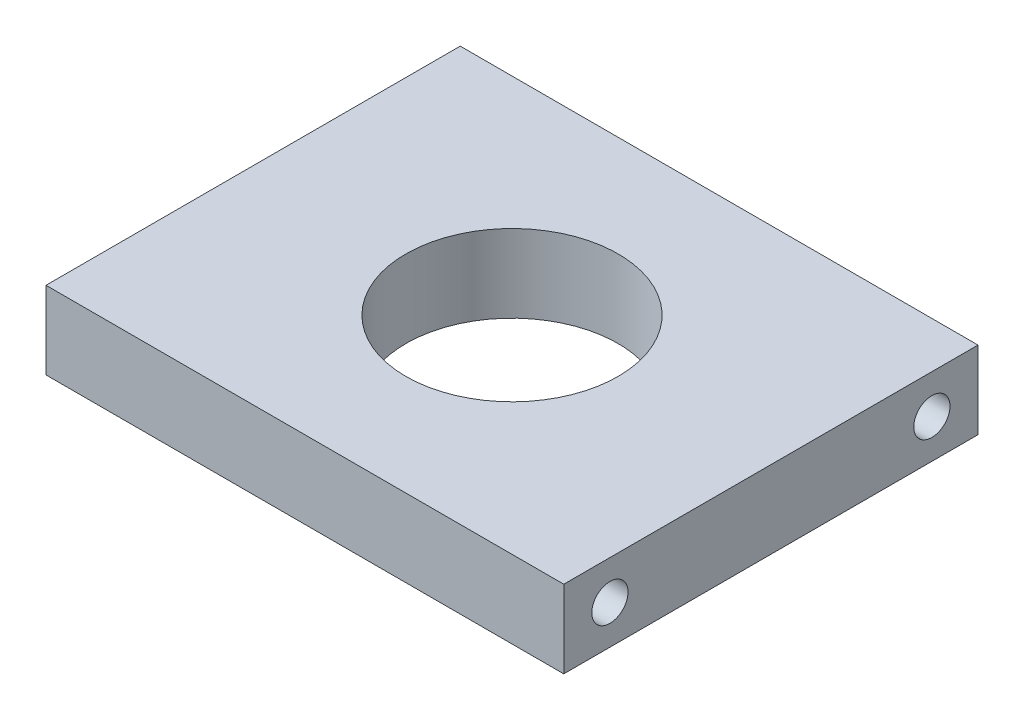
ISO-10303-21;
HEADER;
FILE_DESCRIPTION(('STEP AP214'),'2;1');
FILE_NAME('part.step','',(''),(''),'','','');
FILE_SCHEMA(('AUTOMOTIVE_DESIGN { 1 0 10303 214 1 1 1 1 }'));
ENDSEC;
DATA;
#1=APPLICATION_CONTEXT('core data for automotive mechanical design processes');
#2=APPLICATION_PROTOCOL_DEFINITION('international standard','automotive_design',2000,#1);
#3=PRODUCT_CONTEXT('',#1,'mechanical');
#4=PRODUCT('Part','Part','',(#3));
#5=PRODUCT_RELATED_PRODUCT_CATEGORY('part','',(#4));
#6=PRODUCT_DEFINITION_FORMATION('','',#4);
#7=PRODUCT_DEFINITION_CONTEXT('part definition',#1,'design');
#8=PRODUCT_DEFINITION('design','',#6,#7);
#9=PRODUCT_DEFINITION_SHAPE('','',#8);
#10=(LENGTH_UNIT() NAMED_UNIT(*) SI_UNIT(.MILLI.,.METRE.));
#11=(NAMED_UNIT(*) PLANE_ANGLE_UNIT() SI_UNIT($,.RADIAN.));
#12=(NAMED_UNIT(*) SI_UNIT($,.STERADIAN.) SOLID_ANGLE_UNIT());
#13=UNCERTAINTY_MEASURE_WITH_UNIT(LENGTH_MEASURE(1.E-05),#10,'distance_accuracy_value','');
#14=(GEOMETRIC_REPRESENTATION_CONTEXT(3) GLOBAL_UNCERTAINTY_ASSIGNED_CONTEXT((#13)) GLOBAL_UNIT_ASSIGNED_CONTEXT((#10,
#11,#12)) REPRESENTATION_CONTEXT('',''));
#15=CARTESIAN_POINT('',(0.,0.,0.));
#16=DIRECTION('',(0.,0.,1.));
#17=DIRECTION('',(1.,0.,0.));
#18=AXIS2_PLACEMENT_3D('',#15,#16,#17);
#19=CARTESIAN_POINT('',(0.,15.,0.));
#20=DIRECTION('',(0.,-1.,0.));
#21=DIRECTION('',(0.,0.,-1.));
#22=AXIS2_PLACEMENT_3D('',#19,#20,#21);
#23=PLANE('',#22);
#24=DIRECTION('',(0.,0.,-1.));
#25=VECTOR('',#24,1.);
#26=CARTESIAN_POINT('',(50.,15.,40.));
#27=LINE('',#26,#25);
#28=CARTESIAN_POINT('',(50.,15.,40.));
#29=VERTEX_POINT('',#28);
#30=CARTESIAN_POINT('',(50.,15.,-40.));
#31=VERTEX_POINT('',#30);
#32=EDGE_CURVE('E96',#29,#31,#27,.T.);
#33=ORIENTED_EDGE('',*,*,#32,.T.);
#34=DIRECTION('',(-1.,0.,0.));
#35=VECTOR('',#34,1.);
#36=CARTESIAN_POINT('',(-50.,15.,-40.));
#37=LINE('',#36,#35);
#38=CARTESIAN_POINT('',(-50.,15.,-40.));
#39=VERTEX_POINT('',#38);
#40=EDGE_CURVE('E91',#31,#39,#37,.T.);
#41=ORIENTED_EDGE('',*,*,#40,.T.);
#42=DIRECTION('',(0.,0.,1.));
#43=VECTOR('',#42,1.);
#44=CARTESIAN_POINT('',(-50.,15.,40.));
#45=LINE('',#44,#43);
#46=CARTESIAN_POINT('',(-50.,15.,40.));
#47=VERTEX_POINT('',#46);
#48=EDGE_CURVE('E94',#39,#47,#45,.T.);
#49=ORIENTED_EDGE('',*,*,#48,.T.);
#50=DIRECTION('',(1.,0.,0.));
#51=VECTOR('',#50,1.);
#52=CARTESIAN_POINT('',(-50.,15.,40.));
#53=LINE('',#52,#51);
#54=EDGE_CURVE('E61',#47,#29,#53,.T.);
#55=ORIENTED_EDGE('',*,*,#54,.T.);
#56=EDGE_LOOP('',(#33,#41,#49,#55));
#57=FACE_BOUND('',#56,.T.);
#58=CARTESIAN_POINT('',(0.,15.,0.));
#59=DIRECTION('',(0.,1.,0.));
#60=DIRECTION('',(0.,0.,1.));
#61=AXIS2_PLACEMENT_3D('',#58,#59,#60);
#62=CIRCLE('',#61,20.5);
#63=CARTESIAN_POINT('',(0.,15.,20.5));
#64=VERTEX_POINT('',#63);
#65=EDGE_CURVE('E116',#64,#64,#62,.T.);
#66=ORIENTED_EDGE('',*,*,#65,.F.);
#67=EDGE_LOOP('',(#66));
#68=FACE_BOUND('',#67,.T.);
#69=ADVANCED_FACE('F43',(#57,#68),#23,.F.);
#70=CARTESIAN_POINT('',(0.,0.,0.));
#71=DIRECTION('',(0.,-1.,0.));
#72=DIRECTION('',(0.,0.,-1.));
#73=AXIS2_PLACEMENT_3D('',#70,#71,#72);
#74=PLANE('',#73);
#75=DIRECTION('',(0.,0.,-1.));
#76=VECTOR('',#75,1.);
#77=CARTESIAN_POINT('',(50.,0.,40.));
#78=LINE('',#77,#76);
#79=CARTESIAN_POINT('',(50.,0.,40.));
#80=VERTEX_POINT('',#79);
#81=CARTESIAN_POINT('',(50.,0.,-40.));
#82=VERTEX_POINT('',#81);
#83=EDGE_CURVE('E112',#80,#82,#78,.T.);
#84=ORIENTED_EDGE('',*,*,#83,.F.);
#85=DIRECTION('',(1.,0.,0.));
#86=VECTOR('',#85,1.);
#87=CARTESIAN_POINT('',(-50.,0.,40.));
#88=LINE('',#87,#86);
#89=CARTESIAN_POINT('',(-50.,0.,40.));
#90=VERTEX_POINT('',#89);
#91=EDGE_CURVE('E84',#90,#80,#88,.T.);
#92=ORIENTED_EDGE('',*,*,#91,.F.);
#93=DIRECTION('',(0.,0.,1.));
#94=VECTOR('',#93,1.);
#95=CARTESIAN_POINT('',(-50.,0.,40.));
#96=LINE('',#95,#94);
#97=CARTESIAN_POINT('',(-50.,0.,-40.));
#98=VERTEX_POINT('',#97);
#99=EDGE_CURVE('E78',#98,#90,#96,.T.);
#100=ORIENTED_EDGE('',*,*,#99,.F.);
#101=DIRECTION('',(-1.,0.,0.));
#102=VECTOR('',#101,1.);
#103=CARTESIAN_POINT('',(-50.,0.,-40.));
#104=LINE('',#103,#102);
#105=EDGE_CURVE('E101',#82,#98,#104,.T.);
#106=ORIENTED_EDGE('',*,*,#105,.F.);
#107=EDGE_LOOP('',(#84,#92,#100,#106));
#108=FACE_BOUND('',#107,.T.);
#109=CARTESIAN_POINT('',(0.,0.,0.));
#110=DIRECTION('',(0.,1.,0.));
#111=DIRECTION('',(0.,0.,1.));
#112=AXIS2_PLACEMENT_3D('',#109,#110,#111);
#113=CIRCLE('',#112,20.5);
#114=CARTESIAN_POINT('',(0.,0.,20.5));
#115=VERTEX_POINT('',#114);
#116=EDGE_CURVE('E134',#115,#115,#113,.T.);
#117=ORIENTED_EDGE('',*,*,#116,.T.);
#118=EDGE_LOOP('',(#117));
#119=FACE_BOUND('',#118,.T.);
#120=ADVANCED_FACE('F129',(#108,#119),#74,.T.);
#121=CARTESIAN_POINT('',(50.,15.,40.));
#122=DIRECTION('',(-1.,0.,0.));
#123=DIRECTION('',(0.,0.,1.));
#124=AXIS2_PLACEMENT_3D('',#121,#122,#123);
#125=PLANE('',#124);
#126=CARTESIAN_POINT('',(50.,7.5,31.0914645280266));
#127=DIRECTION('',(1.,0.,0.));
#128=DIRECTION('',(0.,0.,-1.));
#129=AXIS2_PLACEMENT_3D('',#126,#127,#128);
#130=CIRCLE('',#129,3.5);
#131=CARTESIAN_POINT('',(50.,7.5,27.5914645280266));
#132=VERTEX_POINT('',#131);
#133=EDGE_CURVE('E150',#132,#132,#130,.T.);
#134=ORIENTED_EDGE('',*,*,#133,.F.);
#135=EDGE_LOOP('',(#134));
#136=FACE_BOUND('',#135,.T.);
#137=CARTESIAN_POINT('',(50.,7.5,-31.0914645280266));
#138=DIRECTION('',(1.,0.,0.));
#139=DIRECTION('',(0.,0.,1.));
#140=AXIS2_PLACEMENT_3D('',#137,#138,#139);
#141=CIRCLE('',#140,3.5);
#142=CARTESIAN_POINT('',(50.,7.5,-27.5914645280266));
#143=VERTEX_POINT('',#142);
#144=EDGE_CURVE('E146',#143,#143,#141,.T.);
#145=ORIENTED_EDGE('',*,*,#144,.F.);
#146=EDGE_LOOP('',(#145));
#147=FACE_BOUND('',#146,.T.);
#148=ORIENTED_EDGE('',*,*,#83,.T.);
#149=DIRECTION('',(0.,-1.,0.));
#150=VECTOR('',#149,1.);
#151=CARTESIAN_POINT('',(50.,15.,-40.));
#152=LINE('',#151,#150);
#153=EDGE_CURVE('E11',#31,#82,#152,.T.);
#154=ORIENTED_EDGE('',*,*,#153,.F.);
#155=ORIENTED_EDGE('',*,*,#32,.F.);
#156=DIRECTION('',(0.,-1.,0.));
#157=VECTOR('',#156,1.);
#158=CARTESIAN_POINT('',(50.,15.,40.));
#159=LINE('',#158,#157);
#160=EDGE_CURVE('E108',#29,#80,#159,.T.);
#161=ORIENTED_EDGE('',*,*,#160,.T.);
#162=EDGE_LOOP('',(#148,#154,#155,#161));
#163=FACE_BOUND('',#162,.T.);
#164=ADVANCED_FACE('F45',(#136,#147,#163),#125,.F.);
#165=CARTESIAN_POINT('',(-50.,15.,-40.));
#166=DIRECTION('',(0.,0.,1.));
#167=DIRECTION('',(1.,0.,0.));
#168=AXIS2_PLACEMENT_3D('',#165,#166,#167);
#169=PLANE('',#168);
#170=ORIENTED_EDGE('',*,*,#105,.T.);
#171=DIRECTION('',(0.,-1.,0.));
#172=VECTOR('',#171,1.);
#173=CARTESIAN_POINT('',(-50.,15.,-40.));
#174=LINE('',#173,#172);
#175=EDGE_CURVE('E53',#39,#98,#174,.T.);
#176=ORIENTED_EDGE('',*,*,#175,.F.);
#177=ORIENTED_EDGE('',*,*,#40,.F.);
#178=ORIENTED_EDGE('',*,*,#153,.T.);
#179=EDGE_LOOP('',(#170,#176,#177,#178));
#180=FACE_BOUND('',#179,.T.);
#181=ADVANCED_FACE('F100',(#180),#169,.F.);
#182=CARTESIAN_POINT('',(-50.,15.,40.));
#183=DIRECTION('',(1.,0.,0.));
#184=DIRECTION('',(0.,0.,-1.));
#185=AXIS2_PLACEMENT_3D('',#182,#183,#184);
#186=PLANE('',#185);
#187=CARTESIAN_POINT('',(-50.,7.5,31.0914645280266));
#188=DIRECTION('',(1.,0.,0.));
#189=DIRECTION('',(0.,0.,-1.));
#190=AXIS2_PLACEMENT_3D('',#187,#188,#189);
#191=CIRCLE('',#190,3.5);
#192=CARTESIAN_POINT('',(-50.,7.5,27.5914645280266));
#193=VERTEX_POINT('',#192);
#194=EDGE_CURVE('E138',#193,#193,#191,.T.);
#195=ORIENTED_EDGE('',*,*,#194,.T.);
#196=EDGE_LOOP('',(#195));
#197=FACE_BOUND('',#196,.T.);
#198=CARTESIAN_POINT('',(-50.,7.5,-31.0914645280266));
#199=DIRECTION('',(1.,0.,0.));
#200=DIRECTION('',(0.,0.,1.));
#201=AXIS2_PLACEMENT_3D('',#198,#199,#200);
#202=CIRCLE('',#201,3.5);
#203=CARTESIAN_POINT('',(-50.,7.5,-27.5914645280266));
#204=VERTEX_POINT('',#203);
#205=EDGE_CURVE('E142',#204,#204,#202,.T.);
#206=ORIENTED_EDGE('',*,*,#205,.T.);
#207=EDGE_LOOP('',(#206));
#208=FACE_BOUND('',#207,.T.);
#209=ORIENTED_EDGE('',*,*,#99,.T.);
#210=DIRECTION('',(0.,-1.,0.));
#211=VECTOR('',#210,1.);
#212=CARTESIAN_POINT('',(-50.,15.,40.));
#213=LINE('',#212,#211);
#214=EDGE_CURVE('E103',#47,#90,#213,.T.);
#215=ORIENTED_EDGE('',*,*,#214,.F.);
#216=ORIENTED_EDGE('',*,*,#48,.F.);
#217=ORIENTED_EDGE('',*,*,#175,.T.);
#218=EDGE_LOOP('',(#209,#215,#216,#217));
#219=FACE_BOUND('',#218,.T.);
#220=ADVANCED_FACE('F104',(#197,#208,#219),#186,.F.);
#221=CARTESIAN_POINT('',(-50.,15.,40.));
#222=DIRECTION('',(0.,0.,-1.));
#223=DIRECTION('',(-1.,0.,0.));
#224=AXIS2_PLACEMENT_3D('',#221,#222,#223);
#225=PLANE('',#224);
#226=ORIENTED_EDGE('',*,*,#91,.T.);
#227=ORIENTED_EDGE('',*,*,#160,.F.);
#228=ORIENTED_EDGE('',*,*,#54,.F.);
#229=ORIENTED_EDGE('',*,*,#214,.T.);
#230=EDGE_LOOP('',(#226,#227,#228,#229));
#231=FACE_BOUND('',#230,.T.);
#232=ADVANCED_FACE('F126',(#231),#225,.F.);
#233=CARTESIAN_POINT('',(0.,15.,0.));
#234=DIRECTION('',(0.,-1.,0.));
#235=DIRECTION('',(0.,0.,-1.));
#236=AXIS2_PLACEMENT_3D('',#233,#234,#235);
#237=CYLINDRICAL_SURFACE('',#236,20.5);
#238=ORIENTED_EDGE('',*,*,#65,.T.);
#239=EDGE_LOOP('',(#238));
#240=FACE_BOUND('',#239,.T.);
#241=ORIENTED_EDGE('',*,*,#116,.F.);
#242=EDGE_LOOP('',(#241));
#243=FACE_BOUND('',#242,.T.);
#244=ADVANCED_FACE('F172',(#240,#243),#237,.F.);
#245=CARTESIAN_POINT('',(-50.,7.5,-31.0914645280266));
#246=DIRECTION('',(1.,0.,0.));
#247=DIRECTION('',(0.,0.,-1.));
#248=AXIS2_PLACEMENT_3D('',#245,#246,#247);
#249=CYLINDRICAL_SURFACE('',#248,3.5);
#250=ORIENTED_EDGE('',*,*,#205,.F.);
#251=EDGE_LOOP('',(#250));
#252=FACE_BOUND('',#251,.T.);
#253=ORIENTED_EDGE('',*,*,#144,.T.);
#254=EDGE_LOOP('',(#253));
#255=FACE_BOUND('',#254,.T.);
#256=ADVANCED_FACE('F163',(#252,#255),#249,.F.);
#257=CARTESIAN_POINT('',(-50.,7.5,31.0914645280266));
#258=DIRECTION('',(1.,0.,0.));
#259=DIRECTION('',(0.,0.,-1.));
#260=AXIS2_PLACEMENT_3D('',#257,#258,#259);
#261=CYLINDRICAL_SURFACE('',#260,3.5);
#262=ORIENTED_EDGE('',*,*,#194,.F.);
#263=EDGE_LOOP('',(#262));
#264=FACE_BOUND('',#263,.T.);
#265=ORIENTED_EDGE('',*,*,#133,.T.);
#266=EDGE_LOOP('',(#265));
#267=FACE_BOUND('',#266,.T.);
#268=ADVANCED_FACE('F160',(#264,#267),#261,.F.);
#269=CLOSED_SHELL('',(#69,#120,#164,#181,#220,#232,#244,#256,#268));
#270=MANIFOLD_SOLID_BREP('B2',#269);
#271=ADVANCED_BREP_SHAPE_REPRESENTATION('',(#18,#270),#14);
#272=SHAPE_DEFINITION_REPRESENTATION(#9,#271);
ENDSEC;
END-ISO-10303-21;
